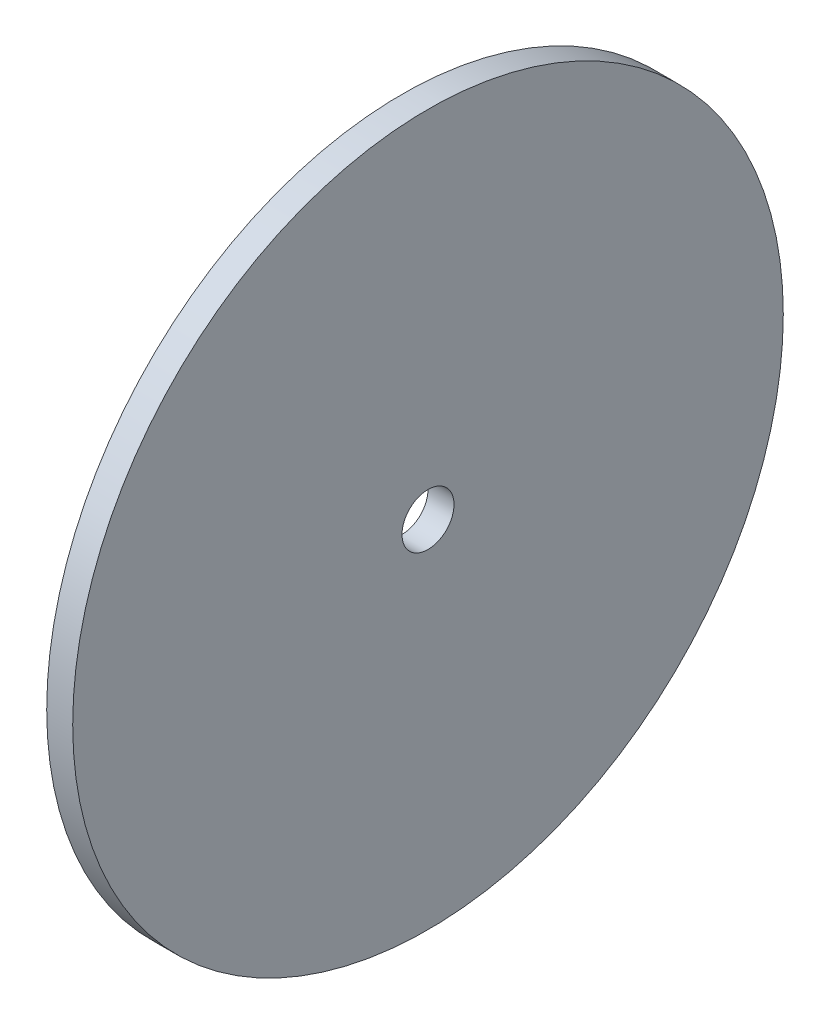
ISO-10303-21;
HEADER;
FILE_DESCRIPTION(('STEP AP214'),'2;1');
FILE_NAME('part.step','',(''),(''),'','','');
FILE_SCHEMA(('AUTOMOTIVE_DESIGN { 1 0 10303 214 1 1 1 1 }'));
ENDSEC;
DATA;
#1=APPLICATION_CONTEXT('core data for automotive mechanical design processes');
#2=APPLICATION_PROTOCOL_DEFINITION('international standard','automotive_design',2000,#1);
#3=PRODUCT_CONTEXT('',#1,'mechanical');
#4=PRODUCT('Part','Part','',(#3));
#5=PRODUCT_RELATED_PRODUCT_CATEGORY('part','',(#4));
#6=PRODUCT_DEFINITION_FORMATION('','',#4);
#7=PRODUCT_DEFINITION_CONTEXT('part definition',#1,'design');
#8=PRODUCT_DEFINITION('design','',#6,#7);
#9=PRODUCT_DEFINITION_SHAPE('','',#8);
#10=(LENGTH_UNIT() NAMED_UNIT(*) SI_UNIT(.MILLI.,.METRE.));
#11=(NAMED_UNIT(*) PLANE_ANGLE_UNIT() SI_UNIT($,.RADIAN.));
#12=(NAMED_UNIT(*) SI_UNIT($,.STERADIAN.) SOLID_ANGLE_UNIT());
#13=UNCERTAINTY_MEASURE_WITH_UNIT(LENGTH_MEASURE(1.E-05),#10,'distance_accuracy_value','');
#14=(GEOMETRIC_REPRESENTATION_CONTEXT(3) GLOBAL_UNCERTAINTY_ASSIGNED_CONTEXT((#13)) GLOBAL_UNIT_ASSIGNED_CONTEXT((#10,
#11,#12)) REPRESENTATION_CONTEXT('',''));
#15=CARTESIAN_POINT('',(0.,0.,0.));
#16=DIRECTION('',(0.,0.,1.));
#17=DIRECTION('',(1.,0.,0.));
#18=AXIS2_PLACEMENT_3D('',#15,#16,#17);
#19=CARTESIAN_POINT('',(1.5,0.,0.));
#20=DIRECTION('',(1.,0.,0.));
#21=DIRECTION('',(0.,0.,-1.));
#22=AXIS2_PLACEMENT_3D('',#19,#20,#21);
#23=PLANE('',#22);
#24=CARTESIAN_POINT('',(1.5,0.,0.));
#25=DIRECTION('',(1.,0.,0.));
#26=DIRECTION('',(0.,0.,-1.));
#27=AXIS2_PLACEMENT_3D('',#24,#25,#26);
#28=CIRCLE('',#27,20.5);
#29=CARTESIAN_POINT('',(1.5,0.,-20.5));
#30=VERTEX_POINT('',#29);
#31=EDGE_CURVE('E10',#30,#30,#28,.T.);
#32=ORIENTED_EDGE('',*,*,#31,.T.);
#33=EDGE_LOOP('',(#32));
#34=FACE_BOUND('',#33,.T.);
#35=CARTESIAN_POINT('',(1.5,0.,0.));
#36=DIRECTION('',(1.,0.,0.));
#37=DIRECTION('',(0.,0.,-1.));
#38=AXIS2_PLACEMENT_3D('',#35,#36,#37);
#39=CIRCLE('',#38,1.5);
#40=CARTESIAN_POINT('',(1.5,0.,-1.5));
#41=VERTEX_POINT('',#40);
#42=EDGE_CURVE('E54',#41,#41,#39,.T.);
#43=ORIENTED_EDGE('',*,*,#42,.F.);
#44=EDGE_LOOP('',(#43));
#45=FACE_BOUND('',#44,.T.);
#46=ADVANCED_FACE('F41',(#34,#45),#23,.T.);
#47=CARTESIAN_POINT('',(0.,0.,0.));
#48=DIRECTION('',(1.,0.,0.));
#49=DIRECTION('',(0.,0.,-1.));
#50=AXIS2_PLACEMENT_3D('',#47,#48,#49);
#51=PLANE('',#50);
#52=CARTESIAN_POINT('',(0.,0.,0.));
#53=DIRECTION('',(1.,0.,0.));
#54=DIRECTION('',(0.,0.,-1.));
#55=AXIS2_PLACEMENT_3D('',#52,#53,#54);
#56=CIRCLE('',#55,20.5);
#57=CARTESIAN_POINT('',(0.,0.,-20.5));
#58=VERTEX_POINT('',#57);
#59=EDGE_CURVE('E45',#58,#58,#56,.T.);
#60=ORIENTED_EDGE('',*,*,#59,.F.);
#61=EDGE_LOOP('',(#60));
#62=FACE_BOUND('',#61,.T.);
#63=CARTESIAN_POINT('',(0.,0.,0.));
#64=DIRECTION('',(1.,0.,0.));
#65=DIRECTION('',(0.,0.,-1.));
#66=AXIS2_PLACEMENT_3D('',#63,#64,#65);
#67=CIRCLE('',#66,1.5);
#68=CARTESIAN_POINT('',(0.,0.,-1.5));
#69=VERTEX_POINT('',#68);
#70=EDGE_CURVE('E56',#69,#69,#67,.T.);
#71=ORIENTED_EDGE('',*,*,#70,.T.);
#72=EDGE_LOOP('',(#71));
#73=FACE_BOUND('',#72,.T.);
#74=ADVANCED_FACE('F68',(#62,#73),#51,.F.);
#75=CARTESIAN_POINT('',(1.5,0.,0.));
#76=DIRECTION('',(-1.,0.,0.));
#77=DIRECTION('',(0.,0.,1.));
#78=AXIS2_PLACEMENT_3D('',#75,#76,#77);
#79=CYLINDRICAL_SURFACE('',#78,20.5);
#80=ORIENTED_EDGE('',*,*,#31,.F.);
#81=EDGE_LOOP('',(#80));
#82=FACE_BOUND('',#81,.T.);
#83=ORIENTED_EDGE('',*,*,#59,.T.);
#84=EDGE_LOOP('',(#83));
#85=FACE_BOUND('',#84,.T.);
#86=ADVANCED_FACE('F43',(#82,#85),#79,.T.);
#87=CARTESIAN_POINT('',(1.5,0.,0.));
#88=DIRECTION('',(-1.,0.,0.));
#89=DIRECTION('',(0.,0.,1.));
#90=AXIS2_PLACEMENT_3D('',#87,#88,#89);
#91=CYLINDRICAL_SURFACE('',#90,1.5);
#92=ORIENTED_EDGE('',*,*,#42,.T.);
#93=EDGE_LOOP('',(#92));
#94=FACE_BOUND('',#93,.T.);
#95=ORIENTED_EDGE('',*,*,#70,.F.);
#96=EDGE_LOOP('',(#95));
#97=FACE_BOUND('',#96,.T.);
#98=ADVANCED_FACE('F64',(#94,#97),#91,.F.);
#99=CLOSED_SHELL('',(#46,#74,#86,#98));
#100=MANIFOLD_SOLID_BREP('B2',#99);
#101=ADVANCED_BREP_SHAPE_REPRESENTATION('',(#18,#100),#14);
#102=SHAPE_DEFINITION_REPRESENTATION(#9,#101);
ENDSEC;
END-ISO-10303-21;
